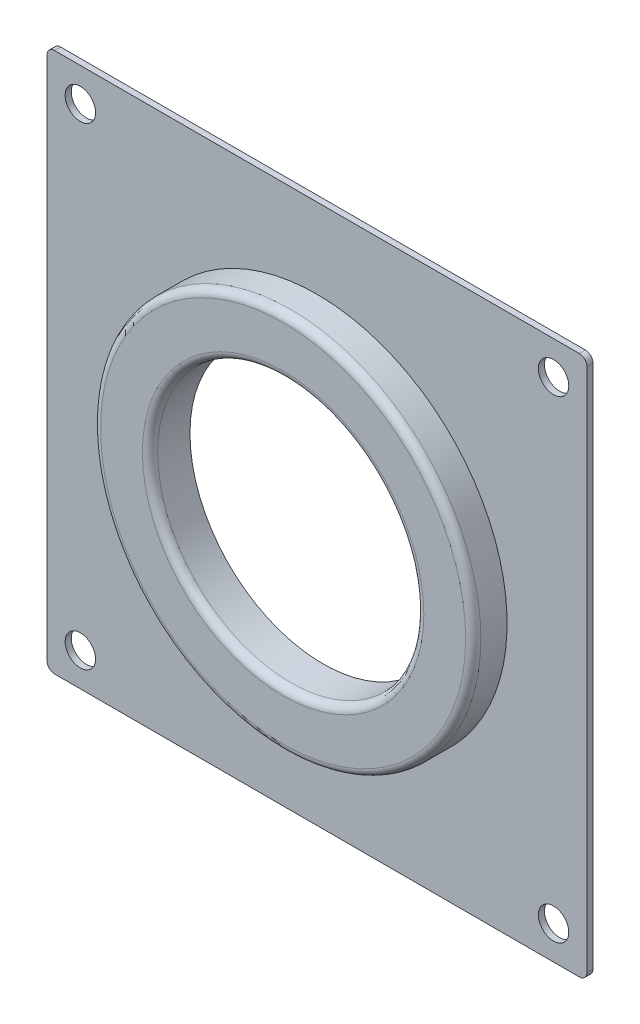
ISO-10303-21;
HEADER;
FILE_DESCRIPTION(('STEP AP214'),'2;1');
FILE_NAME('part.step','',(''),(''),'','','');
FILE_SCHEMA(('AUTOMOTIVE_DESIGN { 1 0 10303 214 1 1 1 1 }'));
ENDSEC;
DATA;
#1=APPLICATION_CONTEXT('core data for automotive mechanical design processes');
#2=APPLICATION_PROTOCOL_DEFINITION('international standard','automotive_design',2000,#1);
#3=PRODUCT_CONTEXT('',#1,'mechanical');
#4=PRODUCT('Part','Part','',(#3));
#5=PRODUCT_RELATED_PRODUCT_CATEGORY('part','',(#4));
#6=PRODUCT_DEFINITION_FORMATION('','',#4);
#7=PRODUCT_DEFINITION_CONTEXT('part definition',#1,'design');
#8=PRODUCT_DEFINITION('design','',#6,#7);
#9=PRODUCT_DEFINITION_SHAPE('','',#8);
#10=(LENGTH_UNIT() NAMED_UNIT(*) SI_UNIT(.MILLI.,.METRE.));
#11=(NAMED_UNIT(*) PLANE_ANGLE_UNIT() SI_UNIT($,.RADIAN.));
#12=(NAMED_UNIT(*) SI_UNIT($,.STERADIAN.) SOLID_ANGLE_UNIT());
#13=UNCERTAINTY_MEASURE_WITH_UNIT(LENGTH_MEASURE(1.E-05),#10,'distance_accuracy_value','');
#14=(GEOMETRIC_REPRESENTATION_CONTEXT(3) GLOBAL_UNCERTAINTY_ASSIGNED_CONTEXT((#13)) GLOBAL_UNIT_ASSIGNED_CONTEXT((#10,
#11,#12)) REPRESENTATION_CONTEXT('',''));
#15=CARTESIAN_POINT('',(0.,0.,0.));
#16=DIRECTION('',(0.,0.,1.));
#17=DIRECTION('',(1.,0.,0.));
#18=AXIS2_PLACEMENT_3D('',#15,#16,#17);
#19=CARTESIAN_POINT('',(35.5,35.5,0.2));
#20=DIRECTION('',(0.,1.,0.));
#21=DIRECTION('',(0.,0.,1.));
#22=AXIS2_PLACEMENT_3D('',#19,#20,#21);
#23=PLANE('',#22);
#24=DIRECTION('',(-1.,0.,0.));
#25=VECTOR('',#24,1.);
#26=CARTESIAN_POINT('',(35.5,35.5,0.2));
#27=LINE('',#26,#25);
#28=CARTESIAN_POINT('',(34.5,35.5,0.2));
#29=VERTEX_POINT('',#28);
#30=CARTESIAN_POINT('',(-34.5,35.5,0.2));
#31=VERTEX_POINT('',#30);
#32=EDGE_CURVE('E100',#29,#31,#27,.T.);
#33=ORIENTED_EDGE('',*,*,#32,.T.);
#34=DIRECTION('',(0.,0.,1.));
#35=VECTOR('',#34,1.);
#36=CARTESIAN_POINT('',(-34.5,35.5,0.2));
#37=LINE('',#36,#35);
#38=CARTESIAN_POINT('',(-34.5,35.5,1.));
#39=VERTEX_POINT('',#38);
#40=EDGE_CURVE('E145',#31,#39,#37,.T.);
#41=ORIENTED_EDGE('',*,*,#40,.T.);
#42=DIRECTION('',(-1.,0.,0.));
#43=VECTOR('',#42,1.);
#44=CARTESIAN_POINT('',(35.5,35.5,1.));
#45=LINE('',#44,#43);
#46=CARTESIAN_POINT('',(34.5,35.5,1.));
#47=VERTEX_POINT('',#46);
#48=EDGE_CURVE('E192',#47,#39,#45,.T.);
#49=ORIENTED_EDGE('',*,*,#48,.F.);
#50=DIRECTION('',(0.,0.,1.));
#51=VECTOR('',#50,1.);
#52=CARTESIAN_POINT('',(34.5,35.5,0.2));
#53=LINE('',#52,#51);
#54=EDGE_CURVE('E139',#29,#47,#53,.T.);
#55=ORIENTED_EDGE('',*,*,#54,.F.);
#56=EDGE_LOOP('',(#33,#41,#49,#55));
#57=FACE_BOUND('',#56,.T.);
#58=ADVANCED_FACE('F43',(#57),#23,.T.);
#59=CARTESIAN_POINT('',(35.5,-35.5,0.2));
#60=DIRECTION('',(1.,0.,0.));
#61=DIRECTION('',(0.,0.,-1.));
#62=AXIS2_PLACEMENT_3D('',#59,#60,#61);
#63=PLANE('',#62);
#64=DIRECTION('',(0.,1.,0.));
#65=VECTOR('',#64,1.);
#66=CARTESIAN_POINT('',(35.5,-35.5,1.));
#67=LINE('',#66,#65);
#68=CARTESIAN_POINT('',(35.5,-34.5,1.));
#69=VERTEX_POINT('',#68);
#70=CARTESIAN_POINT('',(35.5,34.5,1.));
#71=VERTEX_POINT('',#70);
#72=EDGE_CURVE('E87',#69,#71,#67,.T.);
#73=ORIENTED_EDGE('',*,*,#72,.F.);
#74=DIRECTION('',(0.,0.,1.));
#75=VECTOR('',#74,1.);
#76=CARTESIAN_POINT('',(35.5,-34.5,0.2));
#77=LINE('',#76,#75);
#78=CARTESIAN_POINT('',(35.5,-34.5,0.2));
#79=VERTEX_POINT('',#78);
#80=EDGE_CURVE('E135',#79,#69,#77,.T.);
#81=ORIENTED_EDGE('',*,*,#80,.F.);
#82=DIRECTION('',(0.,1.,0.));
#83=VECTOR('',#82,1.);
#84=CARTESIAN_POINT('',(35.5,-35.5,0.2));
#85=LINE('',#84,#83);
#86=CARTESIAN_POINT('',(35.5,34.5,0.2));
#87=VERTEX_POINT('',#86);
#88=EDGE_CURVE('E61',#79,#87,#85,.T.);
#89=ORIENTED_EDGE('',*,*,#88,.T.);
#90=DIRECTION('',(0.,0.,1.));
#91=VECTOR('',#90,1.);
#92=CARTESIAN_POINT('',(35.5,34.5,0.2));
#93=LINE('',#92,#91);
#94=EDGE_CURVE('E166',#87,#71,#93,.T.);
#95=ORIENTED_EDGE('',*,*,#94,.T.);
#96=EDGE_LOOP('',(#73,#81,#89,#95));
#97=FACE_BOUND('',#96,.T.);
#98=ADVANCED_FACE('F252',(#97),#63,.T.);
#99=CARTESIAN_POINT('',(-35.5,-35.5,0.2));
#100=DIRECTION('',(0.,-1.,0.));
#101=DIRECTION('',(1.,0.,0.));
#102=AXIS2_PLACEMENT_3D('',#99,#100,#101);
#103=PLANE('',#102);
#104=DIRECTION('',(1.,0.,0.));
#105=VECTOR('',#104,1.);
#106=CARTESIAN_POINT('',(-35.5,-35.5,0.2));
#107=LINE('',#106,#105);
#108=CARTESIAN_POINT('',(-34.5,-35.5,0.2));
#109=VERTEX_POINT('',#108);
#110=CARTESIAN_POINT('',(34.5,-35.5,0.2));
#111=VERTEX_POINT('',#110);
#112=EDGE_CURVE('E116',#109,#111,#107,.T.);
#113=ORIENTED_EDGE('',*,*,#112,.T.);
#114=DIRECTION('',(0.,0.,1.));
#115=VECTOR('',#114,1.);
#116=CARTESIAN_POINT('',(34.5,-35.5,0.2));
#117=LINE('',#116,#115);
#118=CARTESIAN_POINT('',(34.5,-35.5,1.));
#119=VERTEX_POINT('',#118);
#120=EDGE_CURVE('E119',#111,#119,#117,.T.);
#121=ORIENTED_EDGE('',*,*,#120,.T.);
#122=DIRECTION('',(1.,0.,0.));
#123=VECTOR('',#122,1.);
#124=CARTESIAN_POINT('',(-35.5,-35.5,1.));
#125=LINE('',#124,#123);
#126=CARTESIAN_POINT('',(-34.5,-35.5,1.));
#127=VERTEX_POINT('',#126);
#128=EDGE_CURVE('E205',#127,#119,#125,.T.);
#129=ORIENTED_EDGE('',*,*,#128,.F.);
#130=DIRECTION('',(0.,0.,1.));
#131=VECTOR('',#130,1.);
#132=CARTESIAN_POINT('',(-34.5,-35.5,0.2));
#133=LINE('',#132,#131);
#134=EDGE_CURVE('E122',#109,#127,#133,.T.);
#135=ORIENTED_EDGE('',*,*,#134,.F.);
#136=EDGE_LOOP('',(#113,#121,#129,#135));
#137=FACE_BOUND('',#136,.T.);
#138=ADVANCED_FACE('F118',(#137),#103,.T.);
#139=CARTESIAN_POINT('',(-35.5,35.5,0.2));
#140=DIRECTION('',(-1.,0.,0.));
#141=DIRECTION('',(0.,0.,1.));
#142=AXIS2_PLACEMENT_3D('',#139,#140,#141);
#143=PLANE('',#142);
#144=DIRECTION('',(0.,-1.,0.));
#145=VECTOR('',#144,1.);
#146=CARTESIAN_POINT('',(-35.5,35.5,0.2));
#147=LINE('',#146,#145);
#148=CARTESIAN_POINT('',(-35.5,34.5,0.2));
#149=VERTEX_POINT('',#148);
#150=CARTESIAN_POINT('',(-35.5,-34.5,0.2));
#151=VERTEX_POINT('',#150);
#152=EDGE_CURVE('E127',#149,#151,#147,.T.);
#153=ORIENTED_EDGE('',*,*,#152,.T.);
#154=DIRECTION('',(0.,0.,1.));
#155=VECTOR('',#154,1.);
#156=CARTESIAN_POINT('',(-35.5,-34.5,0.2));
#157=LINE('',#156,#155);
#158=CARTESIAN_POINT('',(-35.5,-34.5,1.));
#159=VERTEX_POINT('',#158);
#160=EDGE_CURVE('E174',#151,#159,#157,.T.);
#161=ORIENTED_EDGE('',*,*,#160,.T.);
#162=DIRECTION('',(0.,-1.,0.));
#163=VECTOR('',#162,1.);
#164=CARTESIAN_POINT('',(-35.5,35.5,1.));
#165=LINE('',#164,#163);
#166=CARTESIAN_POINT('',(-35.5,34.5,1.));
#167=VERTEX_POINT('',#166);
#168=EDGE_CURVE('E202',#167,#159,#165,.T.);
#169=ORIENTED_EDGE('',*,*,#168,.F.);
#170=DIRECTION('',(0.,0.,1.));
#171=VECTOR('',#170,1.);
#172=CARTESIAN_POINT('',(-35.5,34.5,0.2));
#173=LINE('',#172,#171);
#174=EDGE_CURVE('E178',#149,#167,#173,.T.);
#175=ORIENTED_EDGE('',*,*,#174,.F.);
#176=EDGE_LOOP('',(#153,#161,#169,#175));
#177=FACE_BOUND('',#176,.T.);
#178=ADVANCED_FACE('F236',(#177),#143,.T.);
#179=CARTESIAN_POINT('',(0.,0.,0.2));
#180=DIRECTION('',(0.,0.,1.));
#181=DIRECTION('',(1.,0.,0.));
#182=AXIS2_PLACEMENT_3D('',#179,#180,#181);
#183=PLANE('',#182);
#184=CARTESIAN_POINT('',(31.1126983722081,31.1126983722081,0.2));
#185=DIRECTION('',(0.,0.,1.));
#186=DIRECTION('',(1.,0.,0.));
#187=AXIS2_PLACEMENT_3D('',#184,#185,#186);
#188=CIRCLE('',#187,2.);
#189=CARTESIAN_POINT('',(33.1126983722081,31.1126983722081,0.2));
#190=VERTEX_POINT('',#189);
#191=EDGE_CURVE('E404',#190,#190,#188,.F.);
#192=ORIENTED_EDGE('',*,*,#191,.F.);
#193=EDGE_LOOP('',(#192));
#194=FACE_BOUND('',#193,.T.);
#195=CARTESIAN_POINT('',(-31.112698372208,-31.1126983722081,0.2));
#196=DIRECTION('',(0.,0.,1.));
#197=DIRECTION('',(1.,0.,0.));
#198=AXIS2_PLACEMENT_3D('',#195,#196,#197);
#199=CIRCLE('',#198,2.00000000000001);
#200=CARTESIAN_POINT('',(-29.112698372208,-31.1126983722081,0.2));
#201=VERTEX_POINT('',#200);
#202=EDGE_CURVE('E412',#201,#201,#199,.F.);
#203=ORIENTED_EDGE('',*,*,#202,.F.);
#204=EDGE_LOOP('',(#203));
#205=FACE_BOUND('',#204,.T.);
#206=CARTESIAN_POINT('',(31.1126983722081,-31.1126983722081,0.2));
#207=DIRECTION('',(0.,0.,1.));
#208=DIRECTION('',(1.,0.,0.));
#209=AXIS2_PLACEMENT_3D('',#206,#207,#208);
#210=CIRCLE('',#209,2.);
#211=CARTESIAN_POINT('',(33.1126983722081,-31.1126983722081,0.2));
#212=VERTEX_POINT('',#211);
#213=EDGE_CURVE('E403',#212,#212,#210,.F.);
#214=ORIENTED_EDGE('',*,*,#213,.F.);
#215=EDGE_LOOP('',(#214));
#216=FACE_BOUND('',#215,.T.);
#217=CARTESIAN_POINT('',(-31.1126983722081,31.1126983722081,0.2));
#218=DIRECTION('',(0.,0.,1.));
#219=DIRECTION('',(1.,0.,0.));
#220=AXIS2_PLACEMENT_3D('',#217,#218,#219);
#221=CIRCLE('',#220,2.);
#222=CARTESIAN_POINT('',(-29.1126983722081,31.1126983722081,0.2));
#223=VERTEX_POINT('',#222);
#224=EDGE_CURVE('E155',#223,#223,#221,.F.);
#225=ORIENTED_EDGE('',*,*,#224,.F.);
#226=EDGE_LOOP('',(#225));
#227=FACE_BOUND('',#226,.T.);
#228=CARTESIAN_POINT('',(0.,0.,0.200000000000001));
#229=DIRECTION('',(0.,0.,1.));
#230=DIRECTION('',(1.,0.,0.));
#231=AXIS2_PLACEMENT_3D('',#228,#229,#230);
#232=CIRCLE('',#231,17.5);
#233=CARTESIAN_POINT('',(17.5,0.,0.200000000000001));
#234=VERTEX_POINT('',#233);
#235=EDGE_CURVE('E169',#234,#234,#232,.T.);
#236=ORIENTED_EDGE('',*,*,#235,.T.);
#237=EDGE_LOOP('',(#236));
#238=FACE_BOUND('',#237,.T.);
#239=ORIENTED_EDGE('',*,*,#88,.F.);
#240=CARTESIAN_POINT('',(34.5,-34.5,0.2));
#241=DIRECTION('',(0.,0.,1.));
#242=DIRECTION('',(-1.,0.,0.));
#243=AXIS2_PLACEMENT_3D('',#240,#241,#242);
#244=CIRCLE('',#243,1.);
#245=EDGE_CURVE('E132',#111,#79,#244,.T.);
#246=ORIENTED_EDGE('',*,*,#245,.F.);
#247=ORIENTED_EDGE('',*,*,#112,.F.);
#248=CARTESIAN_POINT('',(-34.5,-34.5,0.2));
#249=DIRECTION('',(0.,0.,1.));
#250=DIRECTION('',(-1.,0.,0.));
#251=AXIS2_PLACEMENT_3D('',#248,#249,#250);
#252=CIRCLE('',#251,1.);
#253=EDGE_CURVE('E140',#151,#109,#252,.T.);
#254=ORIENTED_EDGE('',*,*,#253,.F.);
#255=ORIENTED_EDGE('',*,*,#152,.F.);
#256=CARTESIAN_POINT('',(-34.5,34.5,0.2));
#257=DIRECTION('',(0.,0.,1.));
#258=DIRECTION('',(1.,0.,0.));
#259=AXIS2_PLACEMENT_3D('',#256,#257,#258);
#260=CIRCLE('',#259,1.);
#261=EDGE_CURVE('E147',#31,#149,#260,.T.);
#262=ORIENTED_EDGE('',*,*,#261,.F.);
#263=ORIENTED_EDGE('',*,*,#32,.F.);
#264=CARTESIAN_POINT('',(34.5,34.5,0.2));
#265=DIRECTION('',(0.,0.,1.));
#266=DIRECTION('',(1.,0.,0.));
#267=AXIS2_PLACEMENT_3D('',#264,#265,#266);
#268=CIRCLE('',#267,1.);
#269=EDGE_CURVE('E165',#87,#29,#268,.T.);
#270=ORIENTED_EDGE('',*,*,#269,.F.);
#271=EDGE_LOOP('',(#239,#246,#247,#254,#255,#262,#263,#270));
#272=FACE_BOUND('',#271,.T.);
#273=ADVANCED_FACE('F137',(#194,#205,#216,#227,#238,#272),#183,.F.);
#274=CARTESIAN_POINT('',(0.,0.,1.));
#275=DIRECTION('',(0.,0.,1.));
#276=DIRECTION('',(1.,0.,0.));
#277=AXIS2_PLACEMENT_3D('',#274,#275,#276);
#278=PLANE('',#277);
#279=CARTESIAN_POINT('',(31.1126983722081,31.1126983722081,1.));
#280=DIRECTION('',(0.,0.,1.));
#281=DIRECTION('',(1.,0.,0.));
#282=AXIS2_PLACEMENT_3D('',#279,#280,#281);
#283=CIRCLE('',#282,2.);
#284=CARTESIAN_POINT('',(33.1126983722081,31.1126983722081,1.));
#285=VERTEX_POINT('',#284);
#286=EDGE_CURVE('E409',#285,#285,#283,.T.);
#287=ORIENTED_EDGE('',*,*,#286,.F.);
#288=EDGE_LOOP('',(#287));
#289=FACE_BOUND('',#288,.T.);
#290=CARTESIAN_POINT('',(-31.112698372208,-31.1126983722081,1.));
#291=DIRECTION('',(0.,0.,1.));
#292=DIRECTION('',(1.,0.,0.));
#293=AXIS2_PLACEMENT_3D('',#290,#291,#292);
#294=CIRCLE('',#293,2.00000000000001);
#295=CARTESIAN_POINT('',(-29.112698372208,-31.1126983722081,1.));
#296=VERTEX_POINT('',#295);
#297=EDGE_CURVE('E408',#296,#296,#294,.T.);
#298=ORIENTED_EDGE('',*,*,#297,.F.);
#299=EDGE_LOOP('',(#298));
#300=FACE_BOUND('',#299,.T.);
#301=CARTESIAN_POINT('',(31.1126983722081,-31.1126983722081,1.));
#302=DIRECTION('',(0.,0.,1.));
#303=DIRECTION('',(1.,0.,0.));
#304=AXIS2_PLACEMENT_3D('',#301,#302,#303);
#305=CIRCLE('',#304,2.);
#306=CARTESIAN_POINT('',(33.1126983722081,-31.1126983722081,1.));
#307=VERTEX_POINT('',#306);
#308=EDGE_CURVE('E416',#307,#307,#305,.T.);
#309=ORIENTED_EDGE('',*,*,#308,.F.);
#310=EDGE_LOOP('',(#309));
#311=FACE_BOUND('',#310,.T.);
#312=CARTESIAN_POINT('',(-31.1126983722081,31.1126983722081,1.));
#313=DIRECTION('',(0.,0.,1.));
#314=DIRECTION('',(1.,0.,0.));
#315=AXIS2_PLACEMENT_3D('',#312,#313,#314);
#316=CIRCLE('',#315,2.);
#317=CARTESIAN_POINT('',(-29.1126983722081,31.1126983722081,1.));
#318=VERTEX_POINT('',#317);
#319=EDGE_CURVE('E399',#318,#318,#316,.T.);
#320=ORIENTED_EDGE('',*,*,#319,.F.);
#321=EDGE_LOOP('',(#320));
#322=FACE_BOUND('',#321,.T.);
#323=CARTESIAN_POINT('',(0.,0.,1.));
#324=DIRECTION('',(0.,0.,-1.));
#325=DIRECTION('',(-1.,0.,0.));
#326=AXIS2_PLACEMENT_3D('',#323,#324,#325);
#327=CIRCLE('',#326,25.);
#328=CARTESIAN_POINT('',(-25.,0.,1.));
#329=VERTEX_POINT('',#328);
#330=EDGE_CURVE('E188',#329,#329,#327,.T.);
#331=ORIENTED_EDGE('',*,*,#330,.T.);
#332=EDGE_LOOP('',(#331));
#333=FACE_BOUND('',#332,.T.);
#334=ORIENTED_EDGE('',*,*,#128,.T.);
#335=CARTESIAN_POINT('',(34.5,-34.5,1.));
#336=DIRECTION('',(0.,0.,1.));
#337=DIRECTION('',(-1.,0.,0.));
#338=AXIS2_PLACEMENT_3D('',#335,#336,#337);
#339=CIRCLE('',#338,1.);
#340=EDGE_CURVE('E133',#119,#69,#339,.T.);
#341=ORIENTED_EDGE('',*,*,#340,.T.);
#342=ORIENTED_EDGE('',*,*,#72,.T.);
#343=CARTESIAN_POINT('',(34.5,34.5,1.));
#344=DIRECTION('',(0.,0.,1.));
#345=DIRECTION('',(1.,0.,0.));
#346=AXIS2_PLACEMENT_3D('',#343,#344,#345);
#347=CIRCLE('',#346,1.);
#348=EDGE_CURVE('E151',#71,#47,#347,.T.);
#349=ORIENTED_EDGE('',*,*,#348,.T.);
#350=ORIENTED_EDGE('',*,*,#48,.T.);
#351=CARTESIAN_POINT('',(-34.5,34.5,1.));
#352=DIRECTION('',(0.,0.,1.));
#353=DIRECTION('',(1.,0.,0.));
#354=AXIS2_PLACEMENT_3D('',#351,#352,#353);
#355=CIRCLE('',#354,1.);
#356=EDGE_CURVE('E154',#39,#167,#355,.T.);
#357=ORIENTED_EDGE('',*,*,#356,.T.);
#358=ORIENTED_EDGE('',*,*,#168,.T.);
#359=CARTESIAN_POINT('',(-34.5,-34.5,1.));
#360=DIRECTION('',(0.,0.,1.));
#361=DIRECTION('',(-1.,0.,0.));
#362=AXIS2_PLACEMENT_3D('',#359,#360,#361);
#363=CIRCLE('',#362,1.);
#364=EDGE_CURVE('E159',#159,#127,#363,.T.);
#365=ORIENTED_EDGE('',*,*,#364,.T.);
#366=EDGE_LOOP('',(#334,#341,#342,#349,#350,#357,#358,#365));
#367=FACE_BOUND('',#366,.T.);
#368=ADVANCED_FACE('F235',(#289,#300,#311,#322,#333,#367),#278,.T.);
#369=CARTESIAN_POINT('',(0.,0.,5.45));
#370=DIRECTION('',(0.,0.,-1.));
#371=DIRECTION('',(-1.,0.,0.));
#372=AXIS2_PLACEMENT_3D('',#369,#370,#371);
#373=CYLINDRICAL_SURFACE('',#372,25.);
#374=CARTESIAN_POINT('',(0.,0.,4.45));
#375=DIRECTION('',(0.,0.,1.));
#376=DIRECTION('',(1.,0.,0.));
#377=AXIS2_PLACEMENT_3D('',#374,#375,#376);
#378=CIRCLE('',#377,25.);
#379=CARTESIAN_POINT('',(25.,0.,4.45));
#380=VERTEX_POINT('',#379);
#381=EDGE_CURVE('E11',#380,#380,#378,.F.);
#382=ORIENTED_EDGE('',*,*,#381,.T.);
#383=EDGE_LOOP('',(#382));
#384=FACE_BOUND('',#383,.T.);
#385=ORIENTED_EDGE('',*,*,#330,.F.);
#386=EDGE_LOOP('',(#385));
#387=FACE_BOUND('',#386,.T.);
#388=ADVANCED_FACE('F243',(#384,#387),#373,.T.);
#389=CARTESIAN_POINT('',(25.,0.,5.45));
#390=DIRECTION('',(0.,0.,1.));
#391=DIRECTION('',(1.,0.,0.));
#392=AXIS2_PLACEMENT_3D('',#389,#390,#391);
#393=PLANE('',#392);
#394=CARTESIAN_POINT('',(0.,0.,5.45));
#395=DIRECTION('',(0.,0.,1.));
#396=DIRECTION('',(1.,0.,0.));
#397=AXIS2_PLACEMENT_3D('',#394,#395,#396);
#398=CIRCLE('',#397,18.5);
#399=CARTESIAN_POINT('',(18.5,0.,5.45));
#400=VERTEX_POINT('',#399);
#401=EDGE_CURVE('E53',#400,#400,#398,.F.);
#402=ORIENTED_EDGE('',*,*,#401,.T.);
#403=EDGE_LOOP('',(#402));
#404=FACE_BOUND('',#403,.T.);
#405=CARTESIAN_POINT('',(0.,0.,5.45));
#406=DIRECTION('',(0.,0.,1.));
#407=DIRECTION('',(1.,0.,0.));
#408=AXIS2_PLACEMENT_3D('',#405,#406,#407);
#409=CIRCLE('',#408,24.);
#410=CARTESIAN_POINT('',(24.,0.,5.45));
#411=VERTEX_POINT('',#410);
#412=EDGE_CURVE('E213',#411,#411,#409,.T.);
#413=ORIENTED_EDGE('',*,*,#412,.T.);
#414=EDGE_LOOP('',(#413));
#415=FACE_BOUND('',#414,.T.);
#416=ADVANCED_FACE('F220',(#404,#415),#393,.T.);
#417=CARTESIAN_POINT('',(0.,0.,5.45));
#418=DIRECTION('',(0.,0.,1.));
#419=DIRECTION('',(1.,0.,0.));
#420=AXIS2_PLACEMENT_3D('',#417,#418,#419);
#421=CYLINDRICAL_SURFACE('',#420,17.5);
#422=CARTESIAN_POINT('',(0.,0.,4.45));
#423=DIRECTION('',(0.,0.,1.));
#424=DIRECTION('',(1.,0.,0.));
#425=AXIS2_PLACEMENT_3D('',#422,#423,#424);
#426=CIRCLE('',#425,17.5);
#427=CARTESIAN_POINT('',(17.5,0.,4.45));
#428=VERTEX_POINT('',#427);
#429=EDGE_CURVE('E199',#428,#428,#426,.T.);
#430=ORIENTED_EDGE('',*,*,#429,.T.);
#431=EDGE_LOOP('',(#430));
#432=FACE_BOUND('',#431,.T.);
#433=ORIENTED_EDGE('',*,*,#235,.F.);
#434=EDGE_LOOP('',(#433));
#435=FACE_BOUND('',#434,.T.);
#436=ADVANCED_FACE('F226',(#432,#435),#421,.F.);
#437=CARTESIAN_POINT('',(0.,0.,4.45));
#438=DIRECTION('',(0.,0.,1.));
#439=DIRECTION('',(1.,0.,0.));
#440=AXIS2_PLACEMENT_3D('',#437,#438,#439);
#441=TOROIDAL_SURFACE('',#440,18.5,1.);
#442=ORIENTED_EDGE('',*,*,#401,.F.);
#443=EDGE_LOOP('',(#442));
#444=FACE_BOUND('',#443,.T.);
#445=ORIENTED_EDGE('',*,*,#429,.F.);
#446=EDGE_LOOP('',(#445));
#447=FACE_BOUND('',#446,.T.);
#448=ADVANCED_FACE('F223',(#444,#447),#441,.T.);
#449=CARTESIAN_POINT('',(0.,0.,4.45));
#450=DIRECTION('',(0.,0.,1.));
#451=DIRECTION('',(1.,0.,0.));
#452=AXIS2_PLACEMENT_3D('',#449,#450,#451);
#453=TOROIDAL_SURFACE('',#452,24.,1.);
#454=ORIENTED_EDGE('',*,*,#412,.F.);
#455=EDGE_LOOP('',(#454));
#456=FACE_BOUND('',#455,.T.);
#457=ORIENTED_EDGE('',*,*,#381,.F.);
#458=EDGE_LOOP('',(#457));
#459=FACE_BOUND('',#458,.T.);
#460=ADVANCED_FACE('F45',(#456,#459),#453,.T.);
#461=CARTESIAN_POINT('',(34.5,34.5,0.2));
#462=DIRECTION('',(0.,0.,1.));
#463=DIRECTION('',(1.,0.,0.));
#464=AXIS2_PLACEMENT_3D('',#461,#462,#463);
#465=CYLINDRICAL_SURFACE('',#464,1.);
#466=ORIENTED_EDGE('',*,*,#348,.F.);
#467=ORIENTED_EDGE('',*,*,#94,.F.);
#468=ORIENTED_EDGE('',*,*,#269,.T.);
#469=ORIENTED_EDGE('',*,*,#54,.T.);
#470=EDGE_LOOP('',(#466,#467,#468,#469));
#471=FACE_BOUND('',#470,.T.);
#472=ADVANCED_FACE('F285',(#471),#465,.T.);
#473=CARTESIAN_POINT('',(-34.5,34.5,0.2));
#474=DIRECTION('',(0.,0.,1.));
#475=DIRECTION('',(1.,0.,0.));
#476=AXIS2_PLACEMENT_3D('',#473,#474,#475);
#477=CYLINDRICAL_SURFACE('',#476,1.);
#478=ORIENTED_EDGE('',*,*,#356,.F.);
#479=ORIENTED_EDGE('',*,*,#40,.F.);
#480=ORIENTED_EDGE('',*,*,#261,.T.);
#481=ORIENTED_EDGE('',*,*,#174,.T.);
#482=EDGE_LOOP('',(#478,#479,#480,#481));
#483=FACE_BOUND('',#482,.T.);
#484=ADVANCED_FACE('F290',(#483),#477,.T.);
#485=CARTESIAN_POINT('',(-34.5,-34.5,0.2));
#486=DIRECTION('',(0.,0.,1.));
#487=DIRECTION('',(1.,0.,0.));
#488=AXIS2_PLACEMENT_3D('',#485,#486,#487);
#489=CYLINDRICAL_SURFACE('',#488,1.);
#490=ORIENTED_EDGE('',*,*,#364,.F.);
#491=ORIENTED_EDGE('',*,*,#160,.F.);
#492=ORIENTED_EDGE('',*,*,#253,.T.);
#493=ORIENTED_EDGE('',*,*,#134,.T.);
#494=EDGE_LOOP('',(#490,#491,#492,#493));
#495=FACE_BOUND('',#494,.T.);
#496=ADVANCED_FACE('F302',(#495),#489,.T.);
#497=CARTESIAN_POINT('',(34.5,-34.5,0.2));
#498=DIRECTION('',(0.,0.,1.));
#499=DIRECTION('',(1.,0.,0.));
#500=AXIS2_PLACEMENT_3D('',#497,#498,#499);
#501=CYLINDRICAL_SURFACE('',#500,1.);
#502=ORIENTED_EDGE('',*,*,#340,.F.);
#503=ORIENTED_EDGE('',*,*,#120,.F.);
#504=ORIENTED_EDGE('',*,*,#245,.T.);
#505=ORIENTED_EDGE('',*,*,#80,.T.);
#506=EDGE_LOOP('',(#502,#503,#504,#505));
#507=FACE_BOUND('',#506,.T.);
#508=ADVANCED_FACE('F131',(#507),#501,.T.);
#509=CARTESIAN_POINT('',(-31.1126983722081,31.1126983722081,0.199));
#510=DIRECTION('',(0.,0.,1.));
#511=DIRECTION('',(1.,0.,0.));
#512=AXIS2_PLACEMENT_3D('',#509,#510,#511);
#513=CYLINDRICAL_SURFACE('',#512,2.);
#514=CARTESIAN_POINT('',(-29.1126983722081,31.1126983722081,1.));
#515=CARTESIAN_POINT('',(-29.1126983722081,31.1126983722081,0.991666666666667));
#516=CARTESIAN_POINT('',(-29.1126983722081,31.1126983722081,0.983333333333333));
#517=CARTESIAN_POINT('',(-29.1126983722081,31.1126983722081,0.966666666666667));
#518=CARTESIAN_POINT('',(-29.1126983722081,31.1126983722081,0.958333333333333));
#519=CARTESIAN_POINT('',(-29.1126983722081,31.1126983722081,0.941666666666667));
#520=CARTESIAN_POINT('',(-29.1126983722081,31.1126983722081,0.933333333333333));
#521=CARTESIAN_POINT('',(-29.1126983722081,31.1126983722081,0.916666666666667));
#522=CARTESIAN_POINT('',(-29.1126983722081,31.1126983722081,0.908333333333333));
#523=CARTESIAN_POINT('',(-29.1126983722081,31.1126983722081,0.891666666666667));
#524=CARTESIAN_POINT('',(-29.1126983722081,31.1126983722081,0.883333333333333));
#525=CARTESIAN_POINT('',(-29.1126983722081,31.1126983722081,0.866666666666667));
#526=CARTESIAN_POINT('',(-29.1126983722081,31.1126983722081,0.858333333333333));
#527=CARTESIAN_POINT('',(-29.1126983722081,31.1126983722081,0.841666666666667));
#528=CARTESIAN_POINT('',(-29.1126983722081,31.1126983722081,0.833333333333333));
#529=CARTESIAN_POINT('',(-29.1126983722081,31.1126983722081,0.816666666666667));
#530=CARTESIAN_POINT('',(-29.1126983722081,31.1126983722081,0.808333333333333));
#531=CARTESIAN_POINT('',(-29.1126983722081,31.1126983722081,0.791666666666667));
#532=CARTESIAN_POINT('',(-29.1126983722081,31.1126983722081,0.783333333333333));
#533=CARTESIAN_POINT('',(-29.1126983722081,31.1126983722081,0.766666666666667));
#534=CARTESIAN_POINT('',(-29.1126983722081,31.1126983722081,0.758333333333333));
#535=CARTESIAN_POINT('',(-29.1126983722081,31.1126983722081,0.741666666666666));
#536=CARTESIAN_POINT('',(-29.1126983722081,31.1126983722081,0.733333333333333));
#537=CARTESIAN_POINT('',(-29.1126983722081,31.1126983722081,0.716666666666667));
#538=CARTESIAN_POINT('',(-29.1126983722081,31.1126983722081,0.708333333333333));
#539=CARTESIAN_POINT('',(-29.1126983722081,31.1126983722081,0.691666666666667));
#540=CARTESIAN_POINT('',(-29.1126983722081,31.1126983722081,0.683333333333333));
#541=CARTESIAN_POINT('',(-29.1126983722081,31.1126983722081,0.666666666666667));
#542=CARTESIAN_POINT('',(-29.1126983722081,31.1126983722081,0.658333333333333));
#543=CARTESIAN_POINT('',(-29.1126983722081,31.1126983722081,0.641666666666667));
#544=CARTESIAN_POINT('',(-29.1126983722081,31.1126983722081,0.633333333333333));
#545=CARTESIAN_POINT('',(-29.1126983722081,31.1126983722081,0.616666666666667));
#546=CARTESIAN_POINT('',(-29.1126983722081,31.1126983722081,0.608333333333333));
#547=CARTESIAN_POINT('',(-29.1126983722081,31.1126983722081,0.591666666666667));
#548=CARTESIAN_POINT('',(-29.1126983722081,31.1126983722081,0.583333333333333));
#549=CARTESIAN_POINT('',(-29.1126983722081,31.1126983722081,0.566666666666667));
#550=CARTESIAN_POINT('',(-29.1126983722081,31.1126983722081,0.558333333333333));
#551=CARTESIAN_POINT('',(-29.1126983722081,31.1126983722081,0.541666666666667));
#552=CARTESIAN_POINT('',(-29.1126983722081,31.1126983722081,0.533333333333333));
#553=CARTESIAN_POINT('',(-29.1126983722081,31.1126983722081,0.516666666666667));
#554=CARTESIAN_POINT('',(-29.1126983722081,31.1126983722081,0.508333333333333));
#555=CARTESIAN_POINT('',(-29.1126983722081,31.1126983722081,0.491666666666667));
#556=CARTESIAN_POINT('',(-29.1126983722081,31.1126983722081,0.483333333333333));
#557=CARTESIAN_POINT('',(-29.1126983722081,31.1126983722081,0.466666666666667));
#558=CARTESIAN_POINT('',(-29.1126983722081,31.1126983722081,0.458333333333333));
#559=CARTESIAN_POINT('',(-29.1126983722081,31.1126983722081,0.441666666666667));
#560=CARTESIAN_POINT('',(-29.1126983722081,31.1126983722081,0.433333333333333));
#561=CARTESIAN_POINT('',(-29.1126983722081,31.1126983722081,0.416666666666667));
#562=CARTESIAN_POINT('',(-29.1126983722081,31.1126983722081,0.408333333333333));
#563=CARTESIAN_POINT('',(-29.1126983722081,31.1126983722081,0.391666666666667));
#564=CARTESIAN_POINT('',(-29.1126983722081,31.1126983722081,0.383333333333333));
#565=CARTESIAN_POINT('',(-29.1126983722081,31.1126983722081,0.366666666666667));
#566=CARTESIAN_POINT('',(-29.1126983722081,31.1126983722081,0.358333333333333));
#567=CARTESIAN_POINT('',(-29.1126983722081,31.1126983722081,0.341666666666667));
#568=CARTESIAN_POINT('',(-29.1126983722081,31.1126983722081,0.333333333333333));
#569=CARTESIAN_POINT('',(-29.1126983722081,31.1126983722081,0.316666666666667));
#570=CARTESIAN_POINT('',(-29.1126983722081,31.1126983722081,0.308333333333333));
#571=CARTESIAN_POINT('',(-29.1126983722081,31.1126983722081,0.291666666666667));
#572=CARTESIAN_POINT('',(-29.1126983722081,31.1126983722081,0.283333333333333));
#573=CARTESIAN_POINT('',(-29.1126983722081,31.1126983722081,0.266666666666667));
#574=CARTESIAN_POINT('',(-29.1126983722081,31.1126983722081,0.258333333333333));
#575=CARTESIAN_POINT('',(-29.1126983722081,31.1126983722081,0.241666666666667));
#576=CARTESIAN_POINT('',(-29.1126983722081,31.1126983722081,0.233333333333333));
#577=CARTESIAN_POINT('',(-29.1126983722081,31.1126983722081,0.216666666666667));
#578=CARTESIAN_POINT('',(-29.1126983722081,31.1126983722081,0.208333333333333));
#579=CARTESIAN_POINT('',(-29.1126983722081,31.1126983722081,0.2));
#580=B_SPLINE_CURVE_WITH_KNOTS('',3,(#514,#515,#516,#517,#518,#519,#520,#521,#522,#523,#524,
#525,#526,#527,#528,#529,#530,#531,#532,#533,#534,#535,#536,#537,#538,#539,#540,#541,#542,#543,
#544,#545,#546,#547,#548,#549,#550,#551,#552,#553,#554,#555,#556,#557,#558,#559,#560,#561,#562,
#563,#564,#565,#566,#567,#568,#569,#570,#571,#572,#573,#574,#575,#576,#577,#578,#579),
.UNSPECIFIED.,.F.,.F.,(4,2,2,2,2,2,2,2,2,2,2,2,2,2,2,2,2,2,2,2,2,2,2,2,2,2,2,2,2,2,2,2,4),(0.,
0.0250000000000001,0.0500000000000001,0.0750000000000001,0.1,0.125,0.15,0.175,0.2,0.225,0.25,
0.275,0.3,0.325,0.35,0.375,0.4,0.425,0.45,0.475,0.5,0.525,0.55,0.575,0.6,0.625,0.65,0.675,0.7,
0.725,0.75,0.775,0.8),.UNSPECIFIED.);
#581=EDGE_CURVE('BSEAM320',#318,#223,#580,.T.);
#582=ORIENTED_EDGE('',*,*,#319,.T.);
#583=ORIENTED_EDGE('',*,*,#224,.T.);
#584=ORIENTED_EDGE('',*,*,#581,.T.);
#585=ORIENTED_EDGE('',*,*,#581,.F.);
#586=EDGE_LOOP('',(#582,#584,#583,#585));
#587=FACE_BOUND('',#586,.T.);
#588=ADVANCED_FACE('F320',(#587),#513,.F.);
#589=CARTESIAN_POINT('',(31.1126983722081,-31.1126983722081,0.199));
#590=DIRECTION('',(0.,0.,1.));
#591=DIRECTION('',(1.,0.,0.));
#592=AXIS2_PLACEMENT_3D('',#589,#590,#591);
#593=CYLINDRICAL_SURFACE('',#592,2.);
#594=CARTESIAN_POINT('',(33.1126983722081,-31.1126983722081,1.));
#595=CARTESIAN_POINT('',(33.1126983722081,-31.1126983722081,0.991666666666667));
#596=CARTESIAN_POINT('',(33.1126983722081,-31.1126983722081,0.983333333333333));
#597=CARTESIAN_POINT('',(33.1126983722081,-31.1126983722081,0.966666666666667));
#598=CARTESIAN_POINT('',(33.1126983722081,-31.1126983722081,0.958333333333333));
#599=CARTESIAN_POINT('',(33.1126983722081,-31.1126983722081,0.941666666666667));
#600=CARTESIAN_POINT('',(33.1126983722081,-31.1126983722081,0.933333333333333));
#601=CARTESIAN_POINT('',(33.1126983722081,-31.1126983722081,0.916666666666667));
#602=CARTESIAN_POINT('',(33.1126983722081,-31.1126983722081,0.908333333333333));
#603=CARTESIAN_POINT('',(33.1126983722081,-31.1126983722081,0.891666666666667));
#604=CARTESIAN_POINT('',(33.1126983722081,-31.1126983722081,0.883333333333333));
#605=CARTESIAN_POINT('',(33.1126983722081,-31.1126983722081,0.866666666666667));
#606=CARTESIAN_POINT('',(33.1126983722081,-31.1126983722081,0.858333333333333));
#607=CARTESIAN_POINT('',(33.1126983722081,-31.1126983722081,0.841666666666667));
#608=CARTESIAN_POINT('',(33.1126983722081,-31.1126983722081,0.833333333333333));
#609=CARTESIAN_POINT('',(33.1126983722081,-31.1126983722081,0.816666666666667));
#610=CARTESIAN_POINT('',(33.1126983722081,-31.1126983722081,0.808333333333333));
#611=CARTESIAN_POINT('',(33.1126983722081,-31.1126983722081,0.791666666666667));
#612=CARTESIAN_POINT('',(33.1126983722081,-31.1126983722081,0.783333333333333));
#613=CARTESIAN_POINT('',(33.1126983722081,-31.1126983722081,0.766666666666667));
#614=CARTESIAN_POINT('',(33.1126983722081,-31.1126983722081,0.758333333333333));
#615=CARTESIAN_POINT('',(33.1126983722081,-31.1126983722081,0.741666666666666));
#616=CARTESIAN_POINT('',(33.1126983722081,-31.1126983722081,0.733333333333333));
#617=CARTESIAN_POINT('',(33.1126983722081,-31.1126983722081,0.716666666666667));
#618=CARTESIAN_POINT('',(33.1126983722081,-31.1126983722081,0.708333333333333));
#619=CARTESIAN_POINT('',(33.1126983722081,-31.1126983722081,0.691666666666667));
#620=CARTESIAN_POINT('',(33.1126983722081,-31.1126983722081,0.683333333333333));
#621=CARTESIAN_POINT('',(33.1126983722081,-31.1126983722081,0.666666666666667));
#622=CARTESIAN_POINT('',(33.1126983722081,-31.1126983722081,0.658333333333333));
#623=CARTESIAN_POINT('',(33.1126983722081,-31.1126983722081,0.641666666666667));
#624=CARTESIAN_POINT('',(33.1126983722081,-31.1126983722081,0.633333333333333));
#625=CARTESIAN_POINT('',(33.1126983722081,-31.1126983722081,0.616666666666667));
#626=CARTESIAN_POINT('',(33.1126983722081,-31.1126983722081,0.608333333333333));
#627=CARTESIAN_POINT('',(33.1126983722081,-31.1126983722081,0.591666666666667));
#628=CARTESIAN_POINT('',(33.1126983722081,-31.1126983722081,0.583333333333333));
#629=CARTESIAN_POINT('',(33.1126983722081,-31.1126983722081,0.566666666666667));
#630=CARTESIAN_POINT('',(33.1126983722081,-31.1126983722081,0.558333333333333));
#631=CARTESIAN_POINT('',(33.1126983722081,-31.1126983722081,0.541666666666667));
#632=CARTESIAN_POINT('',(33.1126983722081,-31.1126983722081,0.533333333333333));
#633=CARTESIAN_POINT('',(33.1126983722081,-31.1126983722081,0.516666666666667));
#634=CARTESIAN_POINT('',(33.1126983722081,-31.1126983722081,0.508333333333333));
#635=CARTESIAN_POINT('',(33.1126983722081,-31.1126983722081,0.491666666666667));
#636=CARTESIAN_POINT('',(33.1126983722081,-31.1126983722081,0.483333333333333));
#637=CARTESIAN_POINT('',(33.1126983722081,-31.1126983722081,0.466666666666667));
#638=CARTESIAN_POINT('',(33.1126983722081,-31.1126983722081,0.458333333333333));
#639=CARTESIAN_POINT('',(33.1126983722081,-31.1126983722081,0.441666666666667));
#640=CARTESIAN_POINT('',(33.1126983722081,-31.1126983722081,0.433333333333333));
#641=CARTESIAN_POINT('',(33.1126983722081,-31.1126983722081,0.416666666666667));
#642=CARTESIAN_POINT('',(33.1126983722081,-31.1126983722081,0.408333333333333));
#643=CARTESIAN_POINT('',(33.1126983722081,-31.1126983722081,0.391666666666667));
#644=CARTESIAN_POINT('',(33.1126983722081,-31.1126983722081,0.383333333333333));
#645=CARTESIAN_POINT('',(33.1126983722081,-31.1126983722081,0.366666666666667));
#646=CARTESIAN_POINT('',(33.1126983722081,-31.1126983722081,0.358333333333333));
#647=CARTESIAN_POINT('',(33.1126983722081,-31.1126983722081,0.341666666666667));
#648=CARTESIAN_POINT('',(33.1126983722081,-31.1126983722081,0.333333333333333));
#649=CARTESIAN_POINT('',(33.1126983722081,-31.1126983722081,0.316666666666667));
#650=CARTESIAN_POINT('',(33.1126983722081,-31.1126983722081,0.308333333333333));
#651=CARTESIAN_POINT('',(33.1126983722081,-31.1126983722081,0.291666666666667));
#652=CARTESIAN_POINT('',(33.1126983722081,-31.1126983722081,0.283333333333333));
#653=CARTESIAN_POINT('',(33.1126983722081,-31.1126983722081,0.266666666666667));
#654=CARTESIAN_POINT('',(33.1126983722081,-31.1126983722081,0.258333333333333));
#655=CARTESIAN_POINT('',(33.1126983722081,-31.1126983722081,0.241666666666667));
#656=CARTESIAN_POINT('',(33.1126983722081,-31.1126983722081,0.233333333333333));
#657=CARTESIAN_POINT('',(33.1126983722081,-31.1126983722081,0.216666666666667));
#658=CARTESIAN_POINT('',(33.1126983722081,-31.1126983722081,0.208333333333333));
#659=CARTESIAN_POINT('',(33.1126983722081,-31.1126983722081,0.2));
#660=B_SPLINE_CURVE_WITH_KNOTS('',3,(#594,#595,#596,#597,#598,#599,#600,#601,#602,#603,#604,
#605,#606,#607,#608,#609,#610,#611,#612,#613,#614,#615,#616,#617,#618,#619,#620,#621,#622,#623,
#624,#625,#626,#627,#628,#629,#630,#631,#632,#633,#634,#635,#636,#637,#638,#639,#640,#641,#642,
#643,#644,#645,#646,#647,#648,#649,#650,#651,#652,#653,#654,#655,#656,#657,#658,#659),
.UNSPECIFIED.,.F.,.F.,(4,2,2,2,2,2,2,2,2,2,2,2,2,2,2,2,2,2,2,2,2,2,2,2,2,2,2,2,2,2,2,2,4),(0.,
0.0250000000000001,0.0500000000000001,0.0750000000000001,0.1,0.125,0.15,0.175,0.2,0.225,0.25,
0.275,0.3,0.325,0.35,0.375,0.4,0.425,0.45,0.475,0.5,0.525,0.55,0.575,0.6,0.625,0.65,0.675,0.7,
0.725,0.75,0.775,0.8),.UNSPECIFIED.);
#661=EDGE_CURVE('BSEAM341',#307,#212,#660,.T.);
#662=ORIENTED_EDGE('',*,*,#308,.T.);
#663=ORIENTED_EDGE('',*,*,#213,.T.);
#664=ORIENTED_EDGE('',*,*,#661,.T.);
#665=ORIENTED_EDGE('',*,*,#661,.F.);
#666=EDGE_LOOP('',(#662,#664,#663,#665));
#667=FACE_BOUND('',#666,.T.);
#668=ADVANCED_FACE('F341',(#667),#593,.F.);
#669=CARTESIAN_POINT('',(-31.112698372208,-31.1126983722081,0.199));
#670=DIRECTION('',(0.,0.,1.));
#671=DIRECTION('',(1.,0.,0.));
#672=AXIS2_PLACEMENT_3D('',#669,#670,#671);
#673=CYLINDRICAL_SURFACE('',#672,2.00000000000001);
#674=CARTESIAN_POINT('',(-29.112698372208,-31.1126983722081,1.));
#675=CARTESIAN_POINT('',(-29.112698372208,-31.1126983722081,0.991666666666667));
#676=CARTESIAN_POINT('',(-29.112698372208,-31.1126983722081,0.983333333333333));
#677=CARTESIAN_POINT('',(-29.112698372208,-31.1126983722081,0.966666666666667));
#678=CARTESIAN_POINT('',(-29.112698372208,-31.1126983722081,0.958333333333333));
#679=CARTESIAN_POINT('',(-29.112698372208,-31.1126983722081,0.941666666666667));
#680=CARTESIAN_POINT('',(-29.112698372208,-31.1126983722081,0.933333333333333));
#681=CARTESIAN_POINT('',(-29.112698372208,-31.1126983722081,0.916666666666667));
#682=CARTESIAN_POINT('',(-29.112698372208,-31.1126983722081,0.908333333333333));
#683=CARTESIAN_POINT('',(-29.112698372208,-31.1126983722081,0.891666666666667));
#684=CARTESIAN_POINT('',(-29.112698372208,-31.1126983722081,0.883333333333333));
#685=CARTESIAN_POINT('',(-29.112698372208,-31.1126983722081,0.866666666666667));
#686=CARTESIAN_POINT('',(-29.112698372208,-31.1126983722081,0.858333333333333));
#687=CARTESIAN_POINT('',(-29.112698372208,-31.1126983722081,0.841666666666667));
#688=CARTESIAN_POINT('',(-29.112698372208,-31.1126983722081,0.833333333333333));
#689=CARTESIAN_POINT('',(-29.112698372208,-31.1126983722081,0.816666666666667));
#690=CARTESIAN_POINT('',(-29.112698372208,-31.1126983722081,0.808333333333333));
#691=CARTESIAN_POINT('',(-29.112698372208,-31.1126983722081,0.791666666666667));
#692=CARTESIAN_POINT('',(-29.112698372208,-31.1126983722081,0.783333333333333));
#693=CARTESIAN_POINT('',(-29.112698372208,-31.1126983722081,0.766666666666667));
#694=CARTESIAN_POINT('',(-29.112698372208,-31.1126983722081,0.758333333333333));
#695=CARTESIAN_POINT('',(-29.112698372208,-31.1126983722081,0.741666666666666));
#696=CARTESIAN_POINT('',(-29.112698372208,-31.1126983722081,0.733333333333333));
#697=CARTESIAN_POINT('',(-29.112698372208,-31.1126983722081,0.716666666666667));
#698=CARTESIAN_POINT('',(-29.112698372208,-31.1126983722081,0.708333333333333));
#699=CARTESIAN_POINT('',(-29.112698372208,-31.1126983722081,0.691666666666667));
#700=CARTESIAN_POINT('',(-29.112698372208,-31.1126983722081,0.683333333333333));
#701=CARTESIAN_POINT('',(-29.112698372208,-31.1126983722081,0.666666666666667));
#702=CARTESIAN_POINT('',(-29.112698372208,-31.1126983722081,0.658333333333333));
#703=CARTESIAN_POINT('',(-29.112698372208,-31.1126983722081,0.641666666666667));
#704=CARTESIAN_POINT('',(-29.112698372208,-31.1126983722081,0.633333333333333));
#705=CARTESIAN_POINT('',(-29.112698372208,-31.1126983722081,0.616666666666667));
#706=CARTESIAN_POINT('',(-29.112698372208,-31.1126983722081,0.608333333333333));
#707=CARTESIAN_POINT('',(-29.112698372208,-31.1126983722081,0.591666666666667));
#708=CARTESIAN_POINT('',(-29.112698372208,-31.1126983722081,0.583333333333333));
#709=CARTESIAN_POINT('',(-29.112698372208,-31.1126983722081,0.566666666666667));
#710=CARTESIAN_POINT('',(-29.112698372208,-31.1126983722081,0.558333333333333));
#711=CARTESIAN_POINT('',(-29.112698372208,-31.1126983722081,0.541666666666667));
#712=CARTESIAN_POINT('',(-29.112698372208,-31.1126983722081,0.533333333333333));
#713=CARTESIAN_POINT('',(-29.112698372208,-31.1126983722081,0.516666666666667));
#714=CARTESIAN_POINT('',(-29.112698372208,-31.1126983722081,0.508333333333333));
#715=CARTESIAN_POINT('',(-29.112698372208,-31.1126983722081,0.491666666666667));
#716=CARTESIAN_POINT('',(-29.112698372208,-31.1126983722081,0.483333333333333));
#717=CARTESIAN_POINT('',(-29.112698372208,-31.1126983722081,0.466666666666667));
#718=CARTESIAN_POINT('',(-29.112698372208,-31.1126983722081,0.458333333333333));
#719=CARTESIAN_POINT('',(-29.112698372208,-31.1126983722081,0.441666666666667));
#720=CARTESIAN_POINT('',(-29.112698372208,-31.1126983722081,0.433333333333333));
#721=CARTESIAN_POINT('',(-29.112698372208,-31.1126983722081,0.416666666666667));
#722=CARTESIAN_POINT('',(-29.112698372208,-31.1126983722081,0.408333333333333));
#723=CARTESIAN_POINT('',(-29.112698372208,-31.1126983722081,0.391666666666667));
#724=CARTESIAN_POINT('',(-29.112698372208,-31.1126983722081,0.383333333333333));
#725=CARTESIAN_POINT('',(-29.112698372208,-31.1126983722081,0.366666666666667));
#726=CARTESIAN_POINT('',(-29.112698372208,-31.1126983722081,0.358333333333333));
#727=CARTESIAN_POINT('',(-29.112698372208,-31.1126983722081,0.341666666666667));
#728=CARTESIAN_POINT('',(-29.112698372208,-31.1126983722081,0.333333333333333));
#729=CARTESIAN_POINT('',(-29.112698372208,-31.1126983722081,0.316666666666667));
#730=CARTESIAN_POINT('',(-29.112698372208,-31.1126983722081,0.308333333333333));
#731=CARTESIAN_POINT('',(-29.112698372208,-31.1126983722081,0.291666666666667));
#732=CARTESIAN_POINT('',(-29.112698372208,-31.1126983722081,0.283333333333333));
#733=CARTESIAN_POINT('',(-29.112698372208,-31.1126983722081,0.266666666666667));
#734=CARTESIAN_POINT('',(-29.112698372208,-31.1126983722081,0.258333333333333));
#735=CARTESIAN_POINT('',(-29.112698372208,-31.1126983722081,0.241666666666667));
#736=CARTESIAN_POINT('',(-29.112698372208,-31.1126983722081,0.233333333333333));
#737=CARTESIAN_POINT('',(-29.112698372208,-31.1126983722081,0.216666666666667));
#738=CARTESIAN_POINT('',(-29.112698372208,-31.1126983722081,0.208333333333333));
#739=CARTESIAN_POINT('',(-29.112698372208,-31.1126983722081,0.2));
#740=B_SPLINE_CURVE_WITH_KNOTS('',3,(#674,#675,#676,#677,#678,#679,#680,#681,#682,#683,#684,
#685,#686,#687,#688,#689,#690,#691,#692,#693,#694,#695,#696,#697,#698,#699,#700,#701,#702,#703,
#704,#705,#706,#707,#708,#709,#710,#711,#712,#713,#714,#715,#716,#717,#718,#719,#720,#721,#722,
#723,#724,#725,#726,#727,#728,#729,#730,#731,#732,#733,#734,#735,#736,#737,#738,#739),
.UNSPECIFIED.,.F.,.F.,(4,2,2,2,2,2,2,2,2,2,2,2,2,2,2,2,2,2,2,2,2,2,2,2,2,2,2,2,2,2,2,2,4),(0.,
0.0250000000000001,0.0500000000000001,0.0750000000000001,0.1,0.125,0.15,0.175,0.2,0.225,0.25,
0.275,0.3,0.325,0.35,0.375,0.4,0.425,0.45,0.475,0.5,0.525,0.55,0.575,0.6,0.625,0.65,0.675,0.7,
0.725,0.75,0.775,0.8),.UNSPECIFIED.);
#741=EDGE_CURVE('BSEAM351',#296,#201,#740,.T.);
#742=ORIENTED_EDGE('',*,*,#297,.T.);
#743=ORIENTED_EDGE('',*,*,#202,.T.);
#744=ORIENTED_EDGE('',*,*,#741,.T.);
#745=ORIENTED_EDGE('',*,*,#741,.F.);
#746=EDGE_LOOP('',(#742,#744,#743,#745));
#747=FACE_BOUND('',#746,.T.);
#748=ADVANCED_FACE('F351',(#747),#673,.F.);
#749=CARTESIAN_POINT('',(31.1126983722081,31.1126983722081,0.199));
#750=DIRECTION('',(0.,0.,1.));
#751=DIRECTION('',(1.,0.,0.));
#752=AXIS2_PLACEMENT_3D('',#749,#750,#751);
#753=CYLINDRICAL_SURFACE('',#752,2.);
#754=CARTESIAN_POINT('',(33.1126983722081,31.1126983722081,1.));
#755=CARTESIAN_POINT('',(33.1126983722081,31.1126983722081,0.991666666666667));
#756=CARTESIAN_POINT('',(33.1126983722081,31.1126983722081,0.983333333333333));
#757=CARTESIAN_POINT('',(33.1126983722081,31.1126983722081,0.966666666666667));
#758=CARTESIAN_POINT('',(33.1126983722081,31.1126983722081,0.958333333333333));
#759=CARTESIAN_POINT('',(33.1126983722081,31.1126983722081,0.941666666666667));
#760=CARTESIAN_POINT('',(33.1126983722081,31.1126983722081,0.933333333333333));
#761=CARTESIAN_POINT('',(33.1126983722081,31.1126983722081,0.916666666666667));
#762=CARTESIAN_POINT('',(33.1126983722081,31.1126983722081,0.908333333333333));
#763=CARTESIAN_POINT('',(33.1126983722081,31.1126983722081,0.891666666666667));
#764=CARTESIAN_POINT('',(33.1126983722081,31.1126983722081,0.883333333333333));
#765=CARTESIAN_POINT('',(33.1126983722081,31.1126983722081,0.866666666666667));
#766=CARTESIAN_POINT('',(33.1126983722081,31.1126983722081,0.858333333333333));
#767=CARTESIAN_POINT('',(33.1126983722081,31.1126983722081,0.841666666666667));
#768=CARTESIAN_POINT('',(33.1126983722081,31.1126983722081,0.833333333333333));
#769=CARTESIAN_POINT('',(33.1126983722081,31.1126983722081,0.816666666666667));
#770=CARTESIAN_POINT('',(33.1126983722081,31.1126983722081,0.808333333333333));
#771=CARTESIAN_POINT('',(33.1126983722081,31.1126983722081,0.791666666666667));
#772=CARTESIAN_POINT('',(33.1126983722081,31.1126983722081,0.783333333333333));
#773=CARTESIAN_POINT('',(33.1126983722081,31.1126983722081,0.766666666666667));
#774=CARTESIAN_POINT('',(33.1126983722081,31.1126983722081,0.758333333333333));
#775=CARTESIAN_POINT('',(33.1126983722081,31.1126983722081,0.741666666666666));
#776=CARTESIAN_POINT('',(33.1126983722081,31.1126983722081,0.733333333333333));
#777=CARTESIAN_POINT('',(33.1126983722081,31.1126983722081,0.716666666666667));
#778=CARTESIAN_POINT('',(33.1126983722081,31.1126983722081,0.708333333333333));
#779=CARTESIAN_POINT('',(33.1126983722081,31.1126983722081,0.691666666666667));
#780=CARTESIAN_POINT('',(33.1126983722081,31.1126983722081,0.683333333333333));
#781=CARTESIAN_POINT('',(33.1126983722081,31.1126983722081,0.666666666666667));
#782=CARTESIAN_POINT('',(33.1126983722081,31.1126983722081,0.658333333333333));
#783=CARTESIAN_POINT('',(33.1126983722081,31.1126983722081,0.641666666666667));
#784=CARTESIAN_POINT('',(33.1126983722081,31.1126983722081,0.633333333333333));
#785=CARTESIAN_POINT('',(33.1126983722081,31.1126983722081,0.616666666666667));
#786=CARTESIAN_POINT('',(33.1126983722081,31.1126983722081,0.608333333333333));
#787=CARTESIAN_POINT('',(33.1126983722081,31.1126983722081,0.591666666666667));
#788=CARTESIAN_POINT('',(33.1126983722081,31.1126983722081,0.583333333333333));
#789=CARTESIAN_POINT('',(33.1126983722081,31.1126983722081,0.566666666666667));
#790=CARTESIAN_POINT('',(33.1126983722081,31.1126983722081,0.558333333333333));
#791=CARTESIAN_POINT('',(33.1126983722081,31.1126983722081,0.541666666666667));
#792=CARTESIAN_POINT('',(33.1126983722081,31.1126983722081,0.533333333333333));
#793=CARTESIAN_POINT('',(33.1126983722081,31.1126983722081,0.516666666666667));
#794=CARTESIAN_POINT('',(33.1126983722081,31.1126983722081,0.508333333333333));
#795=CARTESIAN_POINT('',(33.1126983722081,31.1126983722081,0.491666666666667));
#796=CARTESIAN_POINT('',(33.1126983722081,31.1126983722081,0.483333333333333));
#797=CARTESIAN_POINT('',(33.1126983722081,31.1126983722081,0.466666666666667));
#798=CARTESIAN_POINT('',(33.1126983722081,31.1126983722081,0.458333333333333));
#799=CARTESIAN_POINT('',(33.1126983722081,31.1126983722081,0.441666666666667));
#800=CARTESIAN_POINT('',(33.1126983722081,31.1126983722081,0.433333333333333));
#801=CARTESIAN_POINT('',(33.1126983722081,31.1126983722081,0.416666666666667));
#802=CARTESIAN_POINT('',(33.1126983722081,31.1126983722081,0.408333333333333));
#803=CARTESIAN_POINT('',(33.1126983722081,31.1126983722081,0.391666666666667));
#804=CARTESIAN_POINT('',(33.1126983722081,31.1126983722081,0.383333333333333));
#805=CARTESIAN_POINT('',(33.1126983722081,31.1126983722081,0.366666666666667));
#806=CARTESIAN_POINT('',(33.1126983722081,31.1126983722081,0.358333333333333));
#807=CARTESIAN_POINT('',(33.1126983722081,31.1126983722081,0.341666666666667));
#808=CARTESIAN_POINT('',(33.1126983722081,31.1126983722081,0.333333333333333));
#809=CARTESIAN_POINT('',(33.1126983722081,31.1126983722081,0.316666666666667));
#810=CARTESIAN_POINT('',(33.1126983722081,31.1126983722081,0.308333333333333));
#811=CARTESIAN_POINT('',(33.1126983722081,31.1126983722081,0.291666666666667));
#812=CARTESIAN_POINT('',(33.1126983722081,31.1126983722081,0.283333333333333));
#813=CARTESIAN_POINT('',(33.1126983722081,31.1126983722081,0.266666666666667));
#814=CARTESIAN_POINT('',(33.1126983722081,31.1126983722081,0.258333333333333));
#815=CARTESIAN_POINT('',(33.1126983722081,31.1126983722081,0.241666666666667));
#816=CARTESIAN_POINT('',(33.1126983722081,31.1126983722081,0.233333333333333));
#817=CARTESIAN_POINT('',(33.1126983722081,31.1126983722081,0.216666666666667));
#818=CARTESIAN_POINT('',(33.1126983722081,31.1126983722081,0.208333333333333));
#819=CARTESIAN_POINT('',(33.1126983722081,31.1126983722081,0.2));
#820=B_SPLINE_CURVE_WITH_KNOTS('',3,(#754,#755,#756,#757,#758,#759,#760,#761,#762,#763,#764,
#765,#766,#767,#768,#769,#770,#771,#772,#773,#774,#775,#776,#777,#778,#779,#780,#781,#782,#783,
#784,#785,#786,#787,#788,#789,#790,#791,#792,#793,#794,#795,#796,#797,#798,#799,#800,#801,#802,
#803,#804,#805,#806,#807,#808,#809,#810,#811,#812,#813,#814,#815,#816,#817,#818,#819),
.UNSPECIFIED.,.F.,.F.,(4,2,2,2,2,2,2,2,2,2,2,2,2,2,2,2,2,2,2,2,2,2,2,2,2,2,2,2,2,2,2,2,4),(0.,
0.0250000000000001,0.0500000000000001,0.0750000000000001,0.1,0.125,0.15,0.175,0.2,0.225,0.25,
0.275,0.3,0.325,0.35,0.375,0.4,0.425,0.45,0.475,0.5,0.525,0.55,0.575,0.6,0.625,0.65,0.675,0.7,
0.725,0.75,0.775,0.8),.UNSPECIFIED.);
#821=EDGE_CURVE('BSEAM361',#285,#190,#820,.T.);
#822=ORIENTED_EDGE('',*,*,#286,.T.);
#823=ORIENTED_EDGE('',*,*,#191,.T.);
#824=ORIENTED_EDGE('',*,*,#821,.T.);
#825=ORIENTED_EDGE('',*,*,#821,.F.);
#826=EDGE_LOOP('',(#822,#824,#823,#825));
#827=FACE_BOUND('',#826,.T.);
#828=ADVANCED_FACE('F361',(#827),#753,.F.);
#829=CLOSED_SHELL('',(#58,#98,#138,#178,#273,#368,#388,#416,#436,#448,#460,#472,#484,#496,#508,
#588,#668,#748,#828));
#830=MANIFOLD_SOLID_BREP('B2',#829);
#831=ADVANCED_BREP_SHAPE_REPRESENTATION('',(#18,#830),#14);
#832=SHAPE_DEFINITION_REPRESENTATION(#9,#831);
ENDSEC;
END-ISO-10303-21;
